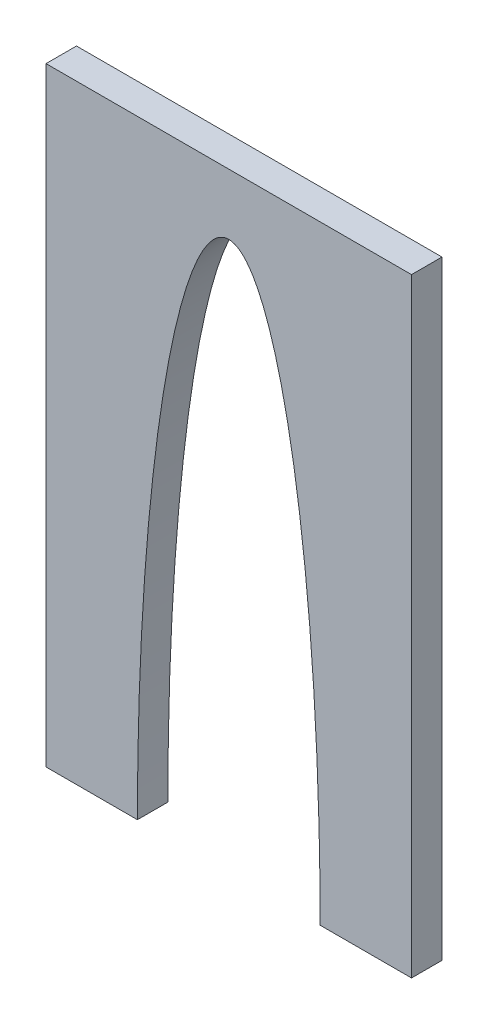
ISO-10303-21;
HEADER;
FILE_DESCRIPTION(('STEP AP214'),'2;1');
FILE_NAME('part.step','',(''),(''),'','','');
FILE_SCHEMA(('AUTOMOTIVE_DESIGN { 1 0 10303 214 1 1 1 1 }'));
ENDSEC;
DATA;
#1=APPLICATION_CONTEXT('core data for automotive mechanical design processes');
#2=APPLICATION_PROTOCOL_DEFINITION('international standard','automotive_design',2000,#1);
#3=PRODUCT_CONTEXT('',#1,'mechanical');
#4=PRODUCT('Part','Part','',(#3));
#5=PRODUCT_RELATED_PRODUCT_CATEGORY('part','',(#4));
#6=PRODUCT_DEFINITION_FORMATION('','',#4);
#7=PRODUCT_DEFINITION_CONTEXT('part definition',#1,'design');
#8=PRODUCT_DEFINITION('design','',#6,#7);
#9=PRODUCT_DEFINITION_SHAPE('','',#8);
#10=(LENGTH_UNIT() NAMED_UNIT(*) SI_UNIT(.MILLI.,.METRE.));
#11=(NAMED_UNIT(*) PLANE_ANGLE_UNIT() SI_UNIT($,.RADIAN.));
#12=(NAMED_UNIT(*) SI_UNIT($,.STERADIAN.) SOLID_ANGLE_UNIT());
#13=UNCERTAINTY_MEASURE_WITH_UNIT(LENGTH_MEASURE(1.E-05),#10,'distance_accuracy_value','');
#14=(GEOMETRIC_REPRESENTATION_CONTEXT(3) GLOBAL_UNCERTAINTY_ASSIGNED_CONTEXT((#13)) GLOBAL_UNIT_ASSIGNED_CONTEXT((#10,
#11,#12)) REPRESENTATION_CONTEXT('',''));
#15=CARTESIAN_POINT('',(0.,0.,0.));
#16=DIRECTION('',(0.,0.,1.));
#17=DIRECTION('',(1.,0.,0.));
#18=AXIS2_PLACEMENT_3D('',#15,#16,#17);
#19=CARTESIAN_POINT('',(0.,0.,1.));
#20=DIRECTION('',(0.,1.,0.));
#21=DIRECTION('',(0.,0.,1.));
#22=AXIS2_PLACEMENT_3D('',#19,#20,#21);
#23=PLANE('',#22);
#24=DIRECTION('',(1.,0.,0.));
#25=VECTOR('',#24,1.);
#26=CARTESIAN_POINT('',(0.,0.,1.));
#27=LINE('',#26,#25);
#28=CARTESIAN_POINT('',(9.,0.,1.));
#29=VERTEX_POINT('',#28);
#30=CARTESIAN_POINT('',(12.,0.,1.));
#31=VERTEX_POINT('',#30);
#32=EDGE_CURVE('E102',#29,#31,#27,.T.);
#33=ORIENTED_EDGE('',*,*,#32,.F.);
#34=DIRECTION('',(0.,0.,-1.));
#35=VECTOR('',#34,1.);
#36=CARTESIAN_POINT('',(9.,0.,1.));
#37=LINE('',#36,#35);
#38=CARTESIAN_POINT('',(9.,0.,0.));
#39=VERTEX_POINT('',#38);
#40=EDGE_CURVE('E92',#29,#39,#37,.T.);
#41=ORIENTED_EDGE('',*,*,#40,.T.);
#42=DIRECTION('',(1.,0.,0.));
#43=VECTOR('',#42,1.);
#44=CARTESIAN_POINT('',(0.,0.,0.));
#45=LINE('',#44,#43);
#46=CARTESIAN_POINT('',(12.,0.,0.));
#47=VERTEX_POINT('',#46);
#48=EDGE_CURVE('E118',#39,#47,#45,.T.);
#49=ORIENTED_EDGE('',*,*,#48,.T.);
#50=DIRECTION('',(0.,0.,-1.));
#51=VECTOR('',#50,1.);
#52=CARTESIAN_POINT('',(12.,0.,1.));
#53=LINE('',#52,#51);
#54=EDGE_CURVE('E106',#31,#47,#53,.T.);
#55=ORIENTED_EDGE('',*,*,#54,.F.);
#56=EDGE_LOOP('',(#33,#41,#49,#55));
#57=FACE_BOUND('',#56,.T.);
#58=ADVANCED_FACE('F32',(#57),#23,.F.);
#59=CARTESIAN_POINT('',(0.,0.,1.));
#60=DIRECTION('',(1.,0.,0.));
#61=DIRECTION('',(0.,0.,-1.));
#62=AXIS2_PLACEMENT_3D('',#59,#60,#61);
#63=PLANE('',#62);
#64=DIRECTION('',(0.,-1.,0.));
#65=VECTOR('',#64,1.);
#66=CARTESIAN_POINT('',(0.,0.,0.));
#67=LINE('',#66,#65);
#68=CARTESIAN_POINT('',(0.,20.,0.));
#69=VERTEX_POINT('',#68);
#70=CARTESIAN_POINT('',(0.,0.,0.));
#71=VERTEX_POINT('',#70);
#72=EDGE_CURVE('E99',#69,#71,#67,.T.);
#73=ORIENTED_EDGE('',*,*,#72,.T.);
#74=DIRECTION('',(0.,0.,-1.));
#75=VECTOR('',#74,1.);
#76=CARTESIAN_POINT('',(0.,0.,1.));
#77=LINE('',#76,#75);
#78=CARTESIAN_POINT('',(0.,0.,1.));
#79=VERTEX_POINT('',#78);
#80=EDGE_CURVE('E40',#79,#71,#77,.T.);
#81=ORIENTED_EDGE('',*,*,#80,.F.);
#82=DIRECTION('',(0.,-1.,0.));
#83=VECTOR('',#82,1.);
#84=CARTESIAN_POINT('',(0.,0.,1.));
#85=LINE('',#84,#83);
#86=CARTESIAN_POINT('',(0.,20.,1.));
#87=VERTEX_POINT('',#86);
#88=EDGE_CURVE('E108',#87,#79,#85,.T.);
#89=ORIENTED_EDGE('',*,*,#88,.F.);
#90=DIRECTION('',(0.,0.,-1.));
#91=VECTOR('',#90,1.);
#92=CARTESIAN_POINT('',(0.,20.,1.));
#93=LINE('',#92,#91);
#94=EDGE_CURVE('E115',#87,#69,#93,.T.);
#95=ORIENTED_EDGE('',*,*,#94,.T.);
#96=EDGE_LOOP('',(#73,#81,#89,#95));
#97=FACE_BOUND('',#96,.T.);
#98=ADVANCED_FACE('F34',(#97),#63,.F.);
#99=CARTESIAN_POINT('',(3.,0.,0.));
#100=VERTEX_POINT('',#99);
#101=EDGE_CURVE('E119',#71,#100,#45,.T.);
#102=ORIENTED_EDGE('',*,*,#101,.T.);
#103=DIRECTION('',(0.,0.,-1.));
#104=VECTOR('',#103,1.);
#105=CARTESIAN_POINT('',(3.,0.,1.));
#106=LINE('',#105,#104);
#107=CARTESIAN_POINT('',(3.,0.,1.));
#108=VERTEX_POINT('',#107);
#109=EDGE_CURVE('E46',#100,#108,#106,.F.);
#110=ORIENTED_EDGE('',*,*,#109,.T.);
#111=EDGE_CURVE('E83',#79,#108,#27,.T.);
#112=ORIENTED_EDGE('',*,*,#111,.F.);
#113=ORIENTED_EDGE('',*,*,#80,.T.);
#114=EDGE_LOOP('',(#102,#110,#112,#113));
#115=FACE_BOUND('',#114,.T.);
#116=ADVANCED_FACE('F129',(#115),#23,.F.);
#117=CARTESIAN_POINT('',(12.,0.,1.));
#118=DIRECTION('',(-1.,0.,0.));
#119=DIRECTION('',(0.,0.,1.));
#120=AXIS2_PLACEMENT_3D('',#117,#118,#119);
#121=PLANE('',#120);
#122=DIRECTION('',(0.,1.,0.));
#123=VECTOR('',#122,1.);
#124=CARTESIAN_POINT('',(12.,0.,0.));
#125=LINE('',#124,#123);
#126=CARTESIAN_POINT('',(12.,20.,0.));
#127=VERTEX_POINT('',#126);
#128=EDGE_CURVE('E122',#47,#127,#125,.T.);
#129=ORIENTED_EDGE('',*,*,#128,.T.);
#130=DIRECTION('',(0.,0.,-1.));
#131=VECTOR('',#130,1.);
#132=CARTESIAN_POINT('',(12.,20.,1.));
#133=LINE('',#132,#131);
#134=CARTESIAN_POINT('',(12.,20.,1.));
#135=VERTEX_POINT('',#134);
#136=EDGE_CURVE('E126',#135,#127,#133,.T.);
#137=ORIENTED_EDGE('',*,*,#136,.F.);
#138=DIRECTION('',(0.,1.,0.));
#139=VECTOR('',#138,1.);
#140=CARTESIAN_POINT('',(12.,0.,1.));
#141=LINE('',#140,#139);
#142=EDGE_CURVE('E110',#31,#135,#141,.T.);
#143=ORIENTED_EDGE('',*,*,#142,.F.);
#144=ORIENTED_EDGE('',*,*,#54,.T.);
#145=EDGE_LOOP('',(#129,#137,#143,#144));
#146=FACE_BOUND('',#145,.T.);
#147=ADVANCED_FACE('F137',(#146),#121,.F.);
#148=CARTESIAN_POINT('',(0.,20.,1.));
#149=DIRECTION('',(0.,-1.,0.));
#150=DIRECTION('',(0.,0.,-1.));
#151=AXIS2_PLACEMENT_3D('',#148,#149,#150);
#152=PLANE('',#151);
#153=DIRECTION('',(-1.,0.,0.));
#154=VECTOR('',#153,1.);
#155=CARTESIAN_POINT('',(0.,20.,0.));
#156=LINE('',#155,#154);
#157=EDGE_CURVE('E76',#127,#69,#156,.T.);
#158=ORIENTED_EDGE('',*,*,#157,.T.);
#159=ORIENTED_EDGE('',*,*,#94,.F.);
#160=DIRECTION('',(-1.,0.,0.));
#161=VECTOR('',#160,1.);
#162=CARTESIAN_POINT('',(0.,20.,1.));
#163=LINE('',#162,#161);
#164=EDGE_CURVE('E55',#135,#87,#163,.T.);
#165=ORIENTED_EDGE('',*,*,#164,.F.);
#166=ORIENTED_EDGE('',*,*,#136,.T.);
#167=EDGE_LOOP('',(#158,#159,#165,#166));
#168=FACE_BOUND('',#167,.T.);
#169=ADVANCED_FACE('F139',(#168),#152,.F.);
#170=CARTESIAN_POINT('',(0.,0.,1.));
#171=DIRECTION('',(0.,0.,-1.));
#172=DIRECTION('',(-1.,0.,0.));
#173=AXIS2_PLACEMENT_3D('',#170,#171,#172);
#174=PLANE('',#173);
#175=ORIENTED_EDGE('',*,*,#111,.T.);
#176=CARTESIAN_POINT('',(6.,0.,1.));
#177=DIRECTION('',(0.,0.,-1.));
#178=DIRECTION('',(0.,1.,0.));
#179=AXIS2_PLACEMENT_3D('',#176,#177,#178);
#180=ELLIPSE('',#179,18.,3.);
#181=EDGE_CURVE('E95',#108,#29,#180,.T.);
#182=ORIENTED_EDGE('',*,*,#181,.T.);
#183=ORIENTED_EDGE('',*,*,#32,.T.);
#184=ORIENTED_EDGE('',*,*,#142,.T.);
#185=ORIENTED_EDGE('',*,*,#164,.T.);
#186=ORIENTED_EDGE('',*,*,#88,.T.);
#187=EDGE_LOOP('',(#175,#182,#183,#184,#185,#186));
#188=FACE_BOUND('',#187,.T.);
#189=ADVANCED_FACE('F101',(#188),#174,.F.);
#190=CARTESIAN_POINT('',(0.,0.,0.));
#191=DIRECTION('',(0.,0.,-1.));
#192=DIRECTION('',(-1.,0.,0.));
#193=AXIS2_PLACEMENT_3D('',#190,#191,#192);
#194=PLANE('',#193);
#195=CARTESIAN_POINT('',(6.,0.,0.));
#196=DIRECTION('',(0.,0.,-1.));
#197=DIRECTION('',(0.,1.,0.));
#198=AXIS2_PLACEMENT_3D('',#195,#196,#197);
#199=ELLIPSE('',#198,18.,3.);
#200=EDGE_CURVE('E11',#100,#39,#199,.T.);
#201=ORIENTED_EDGE('',*,*,#200,.F.);
#202=ORIENTED_EDGE('',*,*,#101,.F.);
#203=ORIENTED_EDGE('',*,*,#72,.F.);
#204=ORIENTED_EDGE('',*,*,#157,.F.);
#205=ORIENTED_EDGE('',*,*,#128,.F.);
#206=ORIENTED_EDGE('',*,*,#48,.F.);
#207=EDGE_LOOP('',(#201,#202,#203,#204,#205,#206));
#208=FACE_BOUND('',#207,.T.);
#209=ADVANCED_FACE('F134',(#208),#194,.T.);
#210=DIRECTION('',(0.,0.,-1.));
#211=VECTOR('',#210,1.);
#212=SURFACE_OF_LINEAR_EXTRUSION('',#180,#211);
#213=ORIENTED_EDGE('',*,*,#181,.F.);
#214=ORIENTED_EDGE('',*,*,#109,.F.);
#215=ORIENTED_EDGE('',*,*,#200,.T.);
#216=ORIENTED_EDGE('',*,*,#40,.F.);
#217=EDGE_LOOP('',(#213,#214,#215,#216));
#218=FACE_BOUND('',#217,.T.);
#219=ADVANCED_FACE('F94',(#218),#212,.F.);
#220=CLOSED_SHELL('',(#58,#98,#116,#147,#169,#189,#209,#219));
#221=MANIFOLD_SOLID_BREP('B2',#220);
#222=ADVANCED_BREP_SHAPE_REPRESENTATION('',(#18,#221),#14);
#223=SHAPE_DEFINITION_REPRESENTATION(#9,#222);
ENDSEC;
END-ISO-10303-21;
